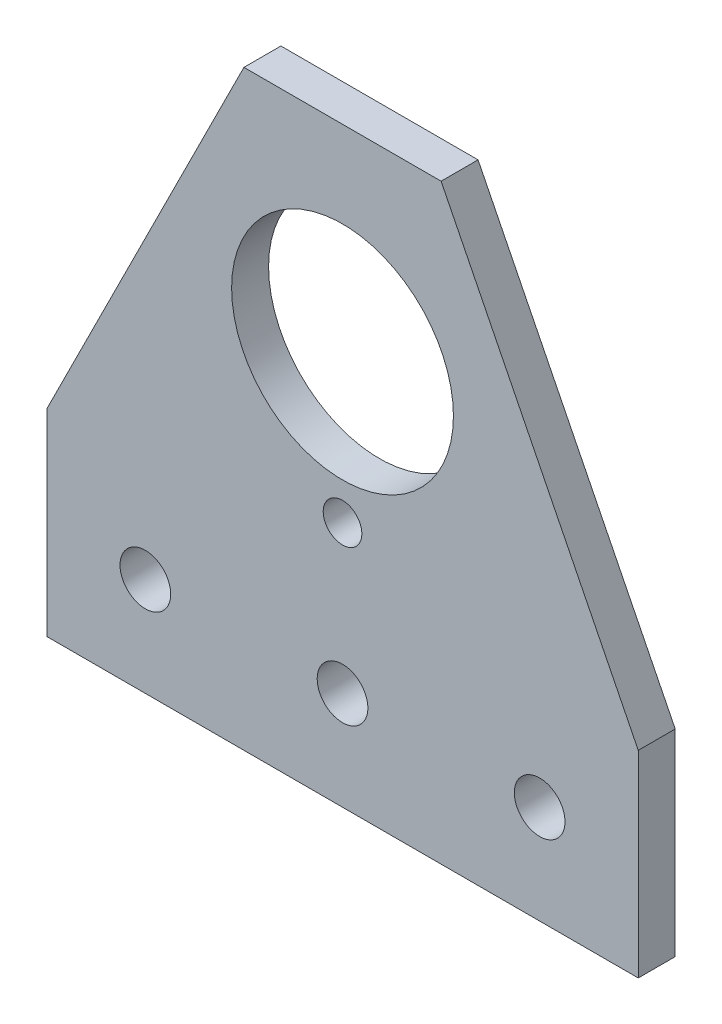
ISO-10303-21;
HEADER;
FILE_DESCRIPTION(('STEP AP214'),'2;1');
FILE_NAME('part.step','',(''),(''),'','','');
FILE_SCHEMA(('AUTOMOTIVE_DESIGN { 1 0 10303 214 1 1 1 1 }'));
ENDSEC;
DATA;
#1=APPLICATION_CONTEXT('core data for automotive mechanical design processes');
#2=APPLICATION_PROTOCOL_DEFINITION('international standard','automotive_design',2000,#1);
#3=PRODUCT_CONTEXT('',#1,'mechanical');
#4=PRODUCT('Part','Part','',(#3));
#5=PRODUCT_RELATED_PRODUCT_CATEGORY('part','',(#4));
#6=PRODUCT_DEFINITION_FORMATION('','',#4);
#7=PRODUCT_DEFINITION_CONTEXT('part definition',#1,'design');
#8=PRODUCT_DEFINITION('design','',#6,#7);
#9=PRODUCT_DEFINITION_SHAPE('','',#8);
#10=(LENGTH_UNIT() NAMED_UNIT(*) SI_UNIT(.MILLI.,.METRE.));
#11=(NAMED_UNIT(*) PLANE_ANGLE_UNIT() SI_UNIT($,.RADIAN.));
#12=(NAMED_UNIT(*) SI_UNIT($,.STERADIAN.) SOLID_ANGLE_UNIT());
#13=UNCERTAINTY_MEASURE_WITH_UNIT(LENGTH_MEASURE(1.E-05),#10,'distance_accuracy_value','');
#14=(GEOMETRIC_REPRESENTATION_CONTEXT(3) GLOBAL_UNCERTAINTY_ASSIGNED_CONTEXT((#13)) GLOBAL_UNIT_ASSIGNED_CONTEXT((#10,
#11,#12)) REPRESENTATION_CONTEXT('',''));
#15=CARTESIAN_POINT('',(0.,0.,0.));
#16=DIRECTION('',(0.,0.,1.));
#17=DIRECTION('',(1.,0.,0.));
#18=AXIS2_PLACEMENT_3D('',#15,#16,#17);
#19=CARTESIAN_POINT('',(0.,0.,4.7625));
#20=DIRECTION('',(0.,0.,1.));
#21=DIRECTION('',(1.,0.,0.));
#22=AXIS2_PLACEMENT_3D('',#19,#20,#21);
#23=PLANE('',#22);
#24=CARTESIAN_POINT('',(38.0999999999999,50.8,4.7625));
#25=DIRECTION('',(0.,0.,1.));
#26=DIRECTION('',(1.,0.,0.));
#27=AXIS2_PLACEMENT_3D('',#24,#25,#26);
#28=CIRCLE('',#27,14.2875);
#29=CARTESIAN_POINT('',(23.8124999999999,50.8,4.7625));
#30=VERTEX_POINT('',#29);
#31=EDGE_CURVE('E192',#30,#30,#28,.T.);
#32=ORIENTED_EDGE('',*,*,#31,.F.);
#33=EDGE_LOOP('',(#32));
#34=FACE_BOUND('',#33,.T.);
#35=CARTESIAN_POINT('',(12.7,12.7,4.7625));
#36=DIRECTION('',(0.,0.,1.));
#37=DIRECTION('',(1.,0.,0.));
#38=AXIS2_PLACEMENT_3D('',#35,#36,#37);
#39=CIRCLE('',#38,3.2639);
#40=CARTESIAN_POINT('',(9.4361,12.7,4.7625));
#41=VERTEX_POINT('',#40);
#42=EDGE_CURVE('E204',#41,#41,#39,.T.);
#43=ORIENTED_EDGE('',*,*,#42,.F.);
#44=EDGE_LOOP('',(#43));
#45=FACE_BOUND('',#44,.T.);
#46=DIRECTION('',(0.,-1.,0.));
#47=VECTOR('',#46,1.);
#48=CARTESIAN_POINT('',(0.,25.4,4.7625));
#49=LINE('',#48,#47);
#50=CARTESIAN_POINT('',(0.,25.4,4.7625));
#51=VERTEX_POINT('',#50);
#52=CARTESIAN_POINT('',(0.,0.,4.7625));
#53=VERTEX_POINT('',#52);
#54=EDGE_CURVE('E128',#51,#53,#49,.T.);
#55=ORIENTED_EDGE('',*,*,#54,.T.);
#56=DIRECTION('',(1.,0.,0.));
#57=VECTOR('',#56,1.);
#58=CARTESIAN_POINT('',(0.,0.,4.7625));
#59=LINE('',#58,#57);
#60=CARTESIAN_POINT('',(76.2,0.,4.7625));
#61=VERTEX_POINT('',#60);
#62=EDGE_CURVE('E86',#53,#61,#59,.T.);
#63=ORIENTED_EDGE('',*,*,#62,.T.);
#64=DIRECTION('',(0.,1.,0.));
#65=VECTOR('',#64,1.);
#66=CARTESIAN_POINT('',(76.2,0.,4.7625));
#67=LINE('',#66,#65);
#68=CARTESIAN_POINT('',(76.2,25.4,4.7625));
#69=VERTEX_POINT('',#68);
#70=EDGE_CURVE('E99',#61,#69,#67,.T.);
#71=ORIENTED_EDGE('',*,*,#70,.T.);
#72=DIRECTION('',(-0.447213595499958,0.894427190999916,0.));
#73=VECTOR('',#72,1.);
#74=CARTESIAN_POINT('',(76.2,25.4,4.7625));
#75=LINE('',#74,#73);
#76=CARTESIAN_POINT('',(50.8,76.2,4.7625));
#77=VERTEX_POINT('',#76);
#78=EDGE_CURVE('E93',#69,#77,#75,.T.);
#79=ORIENTED_EDGE('',*,*,#78,.T.);
#80=DIRECTION('',(-1.,0.,0.));
#81=VECTOR('',#80,1.);
#82=CARTESIAN_POINT('',(50.8,76.2,4.7625));
#83=LINE('',#82,#81);
#84=CARTESIAN_POINT('',(25.4,76.2,4.7625));
#85=VERTEX_POINT('',#84);
#86=EDGE_CURVE('E97',#77,#85,#83,.T.);
#87=ORIENTED_EDGE('',*,*,#86,.T.);
#88=DIRECTION('',(-0.447213595499958,-0.894427190999916,0.));
#89=VECTOR('',#88,1.);
#90=CARTESIAN_POINT('',(25.4,76.2,4.7625));
#91=LINE('',#90,#89);
#92=EDGE_CURVE('E49',#85,#51,#91,.T.);
#93=ORIENTED_EDGE('',*,*,#92,.T.);
#94=EDGE_LOOP('',(#55,#63,#71,#79,#87,#93));
#95=FACE_BOUND('',#94,.T.);
#96=CARTESIAN_POINT('',(38.1,12.7,4.7625));
#97=DIRECTION('',(0.,0.,1.));
#98=DIRECTION('',(1.,0.,0.));
#99=AXIS2_PLACEMENT_3D('',#96,#97,#98);
#100=CIRCLE('',#99,3.2639);
#101=CARTESIAN_POINT('',(34.8361,12.7,4.7625));
#102=VERTEX_POINT('',#101);
#103=EDGE_CURVE('E121',#102,#102,#100,.T.);
#104=ORIENTED_EDGE('',*,*,#103,.F.);
#105=EDGE_LOOP('',(#104));
#106=FACE_BOUND('',#105,.T.);
#107=CARTESIAN_POINT('',(63.5,12.7,4.7625));
#108=DIRECTION('',(0.,0.,1.));
#109=DIRECTION('',(1.,0.,0.));
#110=AXIS2_PLACEMENT_3D('',#107,#108,#109);
#111=CIRCLE('',#110,3.26390000000001);
#112=CARTESIAN_POINT('',(60.2361,12.7,4.7625));
#113=VERTEX_POINT('',#112);
#114=EDGE_CURVE('E198',#113,#113,#111,.T.);
#115=ORIENTED_EDGE('',*,*,#114,.F.);
#116=EDGE_LOOP('',(#115));
#117=FACE_BOUND('',#116,.T.);
#118=CARTESIAN_POINT('',(38.0999999999999,31.75,4.7625));
#119=DIRECTION('',(0.,0.,1.));
#120=DIRECTION('',(1.,0.,0.));
#121=AXIS2_PLACEMENT_3D('',#118,#119,#120);
#122=CIRCLE('',#121,2.4892);
#123=CARTESIAN_POINT('',(35.6107999999999,31.75,4.7625));
#124=VERTEX_POINT('',#123);
#125=EDGE_CURVE('E183',#124,#124,#122,.T.);
#126=ORIENTED_EDGE('',*,*,#125,.F.);
#127=EDGE_LOOP('',(#126));
#128=FACE_BOUND('',#127,.T.);
#129=ADVANCED_FACE('F32',(#34,#45,#95,#106,#117,#128),#23,.T.);
#130=CARTESIAN_POINT('',(0.,0.,0.));
#131=DIRECTION('',(0.,0.,1.));
#132=DIRECTION('',(1.,0.,0.));
#133=AXIS2_PLACEMENT_3D('',#130,#131,#132);
#134=PLANE('',#133);
#135=DIRECTION('',(0.,-1.,0.));
#136=VECTOR('',#135,1.);
#137=CARTESIAN_POINT('',(0.,25.4,0.));
#138=LINE('',#137,#136);
#139=CARTESIAN_POINT('',(0.,25.4,0.));
#140=VERTEX_POINT('',#139);
#141=CARTESIAN_POINT('',(0.,0.,0.));
#142=VERTEX_POINT('',#141);
#143=EDGE_CURVE('E117',#140,#142,#138,.T.);
#144=ORIENTED_EDGE('',*,*,#143,.F.);
#145=DIRECTION('',(-0.447213595499958,-0.894427190999916,0.));
#146=VECTOR('',#145,1.);
#147=CARTESIAN_POINT('',(25.4,76.2,0.));
#148=LINE('',#147,#146);
#149=CARTESIAN_POINT('',(25.4,76.2,0.));
#150=VERTEX_POINT('',#149);
#151=EDGE_CURVE('E78',#150,#140,#148,.T.);
#152=ORIENTED_EDGE('',*,*,#151,.F.);
#153=DIRECTION('',(-1.,0.,0.));
#154=VECTOR('',#153,1.);
#155=CARTESIAN_POINT('',(50.8,76.2,0.));
#156=LINE('',#155,#154);
#157=CARTESIAN_POINT('',(50.8,76.2,0.));
#158=VERTEX_POINT('',#157);
#159=EDGE_CURVE('E72',#158,#150,#156,.T.);
#160=ORIENTED_EDGE('',*,*,#159,.F.);
#161=DIRECTION('',(-0.447213595499958,0.894427190999916,0.));
#162=VECTOR('',#161,1.);
#163=CARTESIAN_POINT('',(76.2,25.4,0.));
#164=LINE('',#163,#162);
#165=CARTESIAN_POINT('',(76.2,25.4,0.));
#166=VERTEX_POINT('',#165);
#167=EDGE_CURVE('E107',#166,#158,#164,.T.);
#168=ORIENTED_EDGE('',*,*,#167,.F.);
#169=DIRECTION('',(0.,1.,0.));
#170=VECTOR('',#169,1.);
#171=CARTESIAN_POINT('',(76.2,0.,0.));
#172=LINE('',#171,#170);
#173=CARTESIAN_POINT('',(76.2,0.,0.));
#174=VERTEX_POINT('',#173);
#175=EDGE_CURVE('E123',#174,#166,#172,.T.);
#176=ORIENTED_EDGE('',*,*,#175,.F.);
#177=DIRECTION('',(1.,0.,0.));
#178=VECTOR('',#177,1.);
#179=CARTESIAN_POINT('',(0.,0.,0.));
#180=LINE('',#179,#178);
#181=EDGE_CURVE('E120',#142,#174,#180,.T.);
#182=ORIENTED_EDGE('',*,*,#181,.F.);
#183=EDGE_LOOP('',(#144,#152,#160,#168,#176,#182));
#184=FACE_BOUND('',#183,.T.);
#185=CARTESIAN_POINT('',(38.1,12.7,0.));
#186=DIRECTION('',(0.,0.,1.));
#187=DIRECTION('',(1.,0.,0.));
#188=AXIS2_PLACEMENT_3D('',#185,#186,#187);
#189=CIRCLE('',#188,3.2639);
#190=CARTESIAN_POINT('',(34.8361,12.7,0.));
#191=VERTEX_POINT('',#190);
#192=EDGE_CURVE('E207',#191,#191,#189,.T.);
#193=ORIENTED_EDGE('',*,*,#192,.T.);
#194=EDGE_LOOP('',(#193));
#195=FACE_BOUND('',#194,.T.);
#196=CARTESIAN_POINT('',(12.7,12.7,0.));
#197=DIRECTION('',(0.,0.,1.));
#198=DIRECTION('',(1.,0.,0.));
#199=AXIS2_PLACEMENT_3D('',#196,#197,#198);
#200=CIRCLE('',#199,3.2639);
#201=CARTESIAN_POINT('',(9.4361,12.7,0.));
#202=VERTEX_POINT('',#201);
#203=EDGE_CURVE('E201',#202,#202,#200,.T.);
#204=ORIENTED_EDGE('',*,*,#203,.T.);
#205=EDGE_LOOP('',(#204));
#206=FACE_BOUND('',#205,.T.);
#207=CARTESIAN_POINT('',(63.5,12.7,0.));
#208=DIRECTION('',(0.,0.,1.));
#209=DIRECTION('',(1.,0.,0.));
#210=AXIS2_PLACEMENT_3D('',#207,#208,#209);
#211=CIRCLE('',#210,3.26390000000001);
#212=CARTESIAN_POINT('',(60.2361,12.7,0.));
#213=VERTEX_POINT('',#212);
#214=EDGE_CURVE('E195',#213,#213,#211,.T.);
#215=ORIENTED_EDGE('',*,*,#214,.T.);
#216=EDGE_LOOP('',(#215));
#217=FACE_BOUND('',#216,.T.);
#218=CARTESIAN_POINT('',(38.0999999999999,50.8,0.));
#219=DIRECTION('',(0.,0.,1.));
#220=DIRECTION('',(1.,0.,0.));
#221=AXIS2_PLACEMENT_3D('',#218,#219,#220);
#222=CIRCLE('',#221,14.2875);
#223=CARTESIAN_POINT('',(23.8124999999999,50.8,0.));
#224=VERTEX_POINT('',#223);
#225=EDGE_CURVE('E189',#224,#224,#222,.T.);
#226=ORIENTED_EDGE('',*,*,#225,.T.);
#227=EDGE_LOOP('',(#226));
#228=FACE_BOUND('',#227,.T.);
#229=CARTESIAN_POINT('',(38.0999999999999,31.75,0.));
#230=DIRECTION('',(0.,0.,1.));
#231=DIRECTION('',(1.,0.,0.));
#232=AXIS2_PLACEMENT_3D('',#229,#230,#231);
#233=CIRCLE('',#232,2.4892);
#234=CARTESIAN_POINT('',(35.6107999999999,31.75,0.));
#235=VERTEX_POINT('',#234);
#236=EDGE_CURVE('E186',#235,#235,#233,.T.);
#237=ORIENTED_EDGE('',*,*,#236,.T.);
#238=EDGE_LOOP('',(#237));
#239=FACE_BOUND('',#238,.T.);
#240=ADVANCED_FACE('F137',(#184,#195,#206,#217,#228,#239),#134,.F.);
#241=CARTESIAN_POINT('',(0.,25.4,4.7625));
#242=DIRECTION('',(1.,0.,0.));
#243=DIRECTION('',(0.,1.,0.));
#244=AXIS2_PLACEMENT_3D('',#241,#242,#243);
#245=PLANE('',#244);
#246=ORIENTED_EDGE('',*,*,#143,.T.);
#247=DIRECTION('',(0.,0.,-1.));
#248=VECTOR('',#247,1.);
#249=CARTESIAN_POINT('',(0.,0.,4.7625));
#250=LINE('',#249,#248);
#251=EDGE_CURVE('E11',#53,#142,#250,.T.);
#252=ORIENTED_EDGE('',*,*,#251,.F.);
#253=ORIENTED_EDGE('',*,*,#54,.F.);
#254=DIRECTION('',(0.,0.,-1.));
#255=VECTOR('',#254,1.);
#256=CARTESIAN_POINT('',(0.,25.4,4.7625));
#257=LINE('',#256,#255);
#258=EDGE_CURVE('E113',#51,#140,#257,.T.);
#259=ORIENTED_EDGE('',*,*,#258,.T.);
#260=EDGE_LOOP('',(#246,#252,#253,#259));
#261=FACE_BOUND('',#260,.T.);
#262=ADVANCED_FACE('F34',(#261),#245,.F.);
#263=CARTESIAN_POINT('',(0.,0.,4.7625));
#264=DIRECTION('',(0.,1.,0.));
#265=DIRECTION('',(0.,0.,1.));
#266=AXIS2_PLACEMENT_3D('',#263,#264,#265);
#267=PLANE('',#266);
#268=ORIENTED_EDGE('',*,*,#181,.T.);
#269=DIRECTION('',(0.,0.,-1.));
#270=VECTOR('',#269,1.);
#271=CARTESIAN_POINT('',(76.2,0.,4.7625));
#272=LINE('',#271,#270);
#273=EDGE_CURVE('E41',#61,#174,#272,.T.);
#274=ORIENTED_EDGE('',*,*,#273,.F.);
#275=ORIENTED_EDGE('',*,*,#62,.F.);
#276=ORIENTED_EDGE('',*,*,#251,.T.);
#277=EDGE_LOOP('',(#268,#274,#275,#276));
#278=FACE_BOUND('',#277,.T.);
#279=ADVANCED_FACE('F274',(#278),#267,.F.);
#280=CARTESIAN_POINT('',(76.2,0.,4.7625));
#281=DIRECTION('',(-1.,0.,0.));
#282=DIRECTION('',(0.,0.,1.));
#283=AXIS2_PLACEMENT_3D('',#280,#281,#282);
#284=PLANE('',#283);
#285=ORIENTED_EDGE('',*,*,#175,.T.);
#286=DIRECTION('',(0.,0.,-1.));
#287=VECTOR('',#286,1.);
#288=CARTESIAN_POINT('',(76.2,25.4,4.7625));
#289=LINE('',#288,#287);
#290=EDGE_CURVE('E108',#69,#166,#289,.T.);
#291=ORIENTED_EDGE('',*,*,#290,.F.);
#292=ORIENTED_EDGE('',*,*,#70,.F.);
#293=ORIENTED_EDGE('',*,*,#273,.T.);
#294=EDGE_LOOP('',(#285,#291,#292,#293));
#295=FACE_BOUND('',#294,.T.);
#296=ADVANCED_FACE('F134',(#295),#284,.F.);
#297=CARTESIAN_POINT('',(76.2,25.4,4.7625));
#298=DIRECTION('',(-0.894427190999916,-0.447213595499958,0.));
#299=DIRECTION('',(0.447213595499958,-0.894427190999916,0.));
#300=AXIS2_PLACEMENT_3D('',#297,#298,#299);
#301=PLANE('',#300);
#302=ORIENTED_EDGE('',*,*,#167,.T.);
#303=DIRECTION('',(0.,0.,-1.));
#304=VECTOR('',#303,1.);
#305=CARTESIAN_POINT('',(50.8,76.2,4.7625));
#306=LINE('',#305,#304);
#307=EDGE_CURVE('E104',#77,#158,#306,.T.);
#308=ORIENTED_EDGE('',*,*,#307,.F.);
#309=ORIENTED_EDGE('',*,*,#78,.F.);
#310=ORIENTED_EDGE('',*,*,#290,.T.);
#311=EDGE_LOOP('',(#302,#308,#309,#310));
#312=FACE_BOUND('',#311,.T.);
#313=ADVANCED_FACE('F105',(#312),#301,.F.);
#314=CARTESIAN_POINT('',(50.8,76.2,4.7625));
#315=DIRECTION('',(0.,-1.,0.));
#316=DIRECTION('',(0.,0.,-1.));
#317=AXIS2_PLACEMENT_3D('',#314,#315,#316);
#318=PLANE('',#317);
#319=ORIENTED_EDGE('',*,*,#159,.T.);
#320=DIRECTION('',(0.,0.,-1.));
#321=VECTOR('',#320,1.);
#322=CARTESIAN_POINT('',(25.4,76.2,4.7625));
#323=LINE('',#322,#321);
#324=EDGE_CURVE('E109',#85,#150,#323,.T.);
#325=ORIENTED_EDGE('',*,*,#324,.F.);
#326=ORIENTED_EDGE('',*,*,#86,.F.);
#327=ORIENTED_EDGE('',*,*,#307,.T.);
#328=EDGE_LOOP('',(#319,#325,#326,#327));
#329=FACE_BOUND('',#328,.T.);
#330=ADVANCED_FACE('F111',(#329),#318,.F.);
#331=CARTESIAN_POINT('',(25.4,76.2,4.7625));
#332=DIRECTION('',(0.894427190999916,-0.447213595499958,0.));
#333=DIRECTION('',(0.447213595499958,0.894427190999916,0.));
#334=AXIS2_PLACEMENT_3D('',#331,#332,#333);
#335=PLANE('',#334);
#336=ORIENTED_EDGE('',*,*,#151,.T.);
#337=ORIENTED_EDGE('',*,*,#258,.F.);
#338=ORIENTED_EDGE('',*,*,#92,.F.);
#339=ORIENTED_EDGE('',*,*,#324,.T.);
#340=EDGE_LOOP('',(#336,#337,#338,#339));
#341=FACE_BOUND('',#340,.T.);
#342=ADVANCED_FACE('F142',(#341),#335,.F.);
#343=CARTESIAN_POINT('',(38.1,12.7,4.7625));
#344=DIRECTION('',(0.,0.,-1.));
#345=DIRECTION('',(-1.,0.,0.));
#346=AXIS2_PLACEMENT_3D('',#343,#344,#345);
#347=CYLINDRICAL_SURFACE('',#346,3.2639);
#348=CARTESIAN_POINT('',(34.8361,12.7,4.7625));
#349=CARTESIAN_POINT('',(34.8361,12.7,4.712890625));
#350=CARTESIAN_POINT('',(34.8361,12.7,4.66328125));
#351=CARTESIAN_POINT('',(34.8361,12.7,4.5640625));
#352=CARTESIAN_POINT('',(34.8361,12.7,4.514453125));
#353=CARTESIAN_POINT('',(34.8361,12.7,4.415234375));
#354=CARTESIAN_POINT('',(34.8361,12.7,4.365625));
#355=CARTESIAN_POINT('',(34.8361,12.7,4.26640625));
#356=CARTESIAN_POINT('',(34.8361,12.7,4.216796875));
#357=CARTESIAN_POINT('',(34.8361,12.7,4.117578125));
#358=CARTESIAN_POINT('',(34.8361,12.7,4.06796875));
#359=CARTESIAN_POINT('',(34.8361,12.7,3.96875));
#360=CARTESIAN_POINT('',(34.8361,12.7,3.919140625));
#361=CARTESIAN_POINT('',(34.8361,12.7,3.819921875));
#362=CARTESIAN_POINT('',(34.8361,12.7,3.7703125));
#363=CARTESIAN_POINT('',(34.8361,12.7,3.67109375));
#364=CARTESIAN_POINT('',(34.8361,12.7,3.621484375));
#365=CARTESIAN_POINT('',(34.8361,12.7,3.522265625));
#366=CARTESIAN_POINT('',(34.8361,12.7,3.47265625));
#367=CARTESIAN_POINT('',(34.8361,12.7,3.3734375));
#368=CARTESIAN_POINT('',(34.8361,12.7,3.323828125));
#369=CARTESIAN_POINT('',(34.8361,12.7,3.224609375));
#370=CARTESIAN_POINT('',(34.8361,12.7,3.175));
#371=CARTESIAN_POINT('',(34.8361,12.7,3.07578125));
#372=CARTESIAN_POINT('',(34.8361,12.7,3.026171875));
#373=CARTESIAN_POINT('',(34.8361,12.7,2.926953125));
#374=CARTESIAN_POINT('',(34.8361,12.7,2.87734375));
#375=CARTESIAN_POINT('',(34.8361,12.7,2.778125));
#376=CARTESIAN_POINT('',(34.8361,12.7,2.728515625));
#377=CARTESIAN_POINT('',(34.8361,12.7,2.629296875));
#378=CARTESIAN_POINT('',(34.8361,12.7,2.5796875));
#379=CARTESIAN_POINT('',(34.8361,12.7,2.48046875));
#380=CARTESIAN_POINT('',(34.8361,12.7,2.430859375));
#381=CARTESIAN_POINT('',(34.8361,12.7,2.331640625));
#382=CARTESIAN_POINT('',(34.8361,12.7,2.28203125));
#383=CARTESIAN_POINT('',(34.8361,12.7,2.1828125));
#384=CARTESIAN_POINT('',(34.8361,12.7,2.133203125));
#385=CARTESIAN_POINT('',(34.8361,12.7,2.033984375));
#386=CARTESIAN_POINT('',(34.8361,12.7,1.984375));
#387=CARTESIAN_POINT('',(34.8361,12.7,1.88515625));
#388=CARTESIAN_POINT('',(34.8361,12.7,1.835546875));
#389=CARTESIAN_POINT('',(34.8361,12.7,1.736328125));
#390=CARTESIAN_POINT('',(34.8361,12.7,1.68671875));
#391=CARTESIAN_POINT('',(34.8361,12.7,1.5875));
#392=CARTESIAN_POINT('',(34.8361,12.7,1.537890625));
#393=CARTESIAN_POINT('',(34.8361,12.7,1.438671875));
#394=CARTESIAN_POINT('',(34.8361,12.7,1.3890625));
#395=CARTESIAN_POINT('',(34.8361,12.7,1.28984375));
#396=CARTESIAN_POINT('',(34.8361,12.7,1.240234375));
#397=CARTESIAN_POINT('',(34.8361,12.7,1.141015625));
#398=CARTESIAN_POINT('',(34.8361,12.7,1.09140625));
#399=CARTESIAN_POINT('',(34.8361,12.7,0.9921875));
#400=CARTESIAN_POINT('',(34.8361,12.7,0.942578125));
#401=CARTESIAN_POINT('',(34.8361,12.7,0.843359375));
#402=CARTESIAN_POINT('',(34.8361,12.7,0.79375));
#403=CARTESIAN_POINT('',(34.8361,12.7,0.69453125));
#404=CARTESIAN_POINT('',(34.8361,12.7,0.644921875));
#405=CARTESIAN_POINT('',(34.8361,12.7,0.545703125));
#406=CARTESIAN_POINT('',(34.8361,12.7,0.49609375));
#407=CARTESIAN_POINT('',(34.8361,12.7,0.396875));
#408=CARTESIAN_POINT('',(34.8361,12.7,0.347265625));
#409=CARTESIAN_POINT('',(34.8361,12.7,0.248046875));
#410=CARTESIAN_POINT('',(34.8361,12.7,0.1984375));
#411=CARTESIAN_POINT('',(34.8361,12.7,0.09921875));
#412=CARTESIAN_POINT('',(34.8361,12.7,0.049609375));
#413=CARTESIAN_POINT('',(34.8361,12.7,0.));
#414=B_SPLINE_CURVE_WITH_KNOTS('',3,(#348,#349,#350,#351,#352,#353,#354,#355,#356,#357,#358,
#359,#360,#361,#362,#363,#364,#365,#366,#367,#368,#369,#370,#371,#372,#373,#374,#375,#376,#377,
#378,#379,#380,#381,#382,#383,#384,#385,#386,#387,#388,#389,#390,#391,#392,#393,#394,#395,#396,
#397,#398,#399,#400,#401,#402,#403,#404,#405,#406,#407,#408,#409,#410,#411,#412,#413),
.UNSPECIFIED.,.F.,.F.,(4,2,2,2,2,2,2,2,2,2,2,2,2,2,2,2,2,2,2,2,2,2,2,2,2,2,2,2,2,2,2,2,4),(0.,
0.148828124999999,0.297656249999999,0.446484374999999,0.595312499999999,0.744140625,0.89296875,
1.041796875,1.190625,1.339453125,1.48828125,1.637109375,1.7859375,1.934765625,2.08359375,
2.232421875,2.38125,2.530078125,2.67890625,2.827734375,2.9765625,3.125390625,3.27421875,
3.423046875,3.571875,3.720703125,3.86953125,4.018359375,4.1671875,4.316015625,4.46484375,
4.613671875,4.7625),.UNSPECIFIED.);
#415=EDGE_CURVE('BSEAM144',#102,#191,#414,.T.);
#416=ORIENTED_EDGE('',*,*,#103,.T.);
#417=ORIENTED_EDGE('',*,*,#192,.F.);
#418=ORIENTED_EDGE('',*,*,#415,.T.);
#419=ORIENTED_EDGE('',*,*,#415,.F.);
#420=EDGE_LOOP('',(#416,#418,#417,#419));
#421=FACE_BOUND('',#420,.T.);
#422=ADVANCED_FACE('F144',(#421),#347,.F.);
#423=CARTESIAN_POINT('',(12.7,12.7,4.7625));
#424=DIRECTION('',(0.,0.,-1.));
#425=DIRECTION('',(-1.,0.,0.));
#426=AXIS2_PLACEMENT_3D('',#423,#424,#425);
#427=CYLINDRICAL_SURFACE('',#426,3.2639);
#428=CARTESIAN_POINT('',(9.4361,12.7,4.7625));
#429=CARTESIAN_POINT('',(9.4361,12.7,4.712890625));
#430=CARTESIAN_POINT('',(9.4361,12.7,4.66328125));
#431=CARTESIAN_POINT('',(9.4361,12.7,4.5640625));
#432=CARTESIAN_POINT('',(9.4361,12.7,4.514453125));
#433=CARTESIAN_POINT('',(9.4361,12.7,4.415234375));
#434=CARTESIAN_POINT('',(9.4361,12.7,4.365625));
#435=CARTESIAN_POINT('',(9.4361,12.7,4.26640625));
#436=CARTESIAN_POINT('',(9.4361,12.7,4.216796875));
#437=CARTESIAN_POINT('',(9.4361,12.7,4.117578125));
#438=CARTESIAN_POINT('',(9.4361,12.7,4.06796875));
#439=CARTESIAN_POINT('',(9.4361,12.7,3.96875));
#440=CARTESIAN_POINT('',(9.4361,12.7,3.919140625));
#441=CARTESIAN_POINT('',(9.4361,12.7,3.819921875));
#442=CARTESIAN_POINT('',(9.4361,12.7,3.7703125));
#443=CARTESIAN_POINT('',(9.4361,12.7,3.67109375));
#444=CARTESIAN_POINT('',(9.4361,12.7,3.621484375));
#445=CARTESIAN_POINT('',(9.4361,12.7,3.522265625));
#446=CARTESIAN_POINT('',(9.4361,12.7,3.47265625));
#447=CARTESIAN_POINT('',(9.4361,12.7,3.3734375));
#448=CARTESIAN_POINT('',(9.4361,12.7,3.323828125));
#449=CARTESIAN_POINT('',(9.4361,12.7,3.224609375));
#450=CARTESIAN_POINT('',(9.4361,12.7,3.175));
#451=CARTESIAN_POINT('',(9.4361,12.7,3.07578125));
#452=CARTESIAN_POINT('',(9.4361,12.7,3.026171875));
#453=CARTESIAN_POINT('',(9.4361,12.7,2.926953125));
#454=CARTESIAN_POINT('',(9.4361,12.7,2.87734375));
#455=CARTESIAN_POINT('',(9.4361,12.7,2.778125));
#456=CARTESIAN_POINT('',(9.4361,12.7,2.728515625));
#457=CARTESIAN_POINT('',(9.4361,12.7,2.629296875));
#458=CARTESIAN_POINT('',(9.4361,12.7,2.5796875));
#459=CARTESIAN_POINT('',(9.4361,12.7,2.48046875));
#460=CARTESIAN_POINT('',(9.4361,12.7,2.430859375));
#461=CARTESIAN_POINT('',(9.4361,12.7,2.331640625));
#462=CARTESIAN_POINT('',(9.4361,12.7,2.28203125));
#463=CARTESIAN_POINT('',(9.4361,12.7,2.1828125));
#464=CARTESIAN_POINT('',(9.4361,12.7,2.133203125));
#465=CARTESIAN_POINT('',(9.4361,12.7,2.033984375));
#466=CARTESIAN_POINT('',(9.4361,12.7,1.984375));
#467=CARTESIAN_POINT('',(9.4361,12.7,1.88515625));
#468=CARTESIAN_POINT('',(9.4361,12.7,1.835546875));
#469=CARTESIAN_POINT('',(9.4361,12.7,1.736328125));
#470=CARTESIAN_POINT('',(9.4361,12.7,1.68671875));
#471=CARTESIAN_POINT('',(9.4361,12.7,1.5875));
#472=CARTESIAN_POINT('',(9.4361,12.7,1.537890625));
#473=CARTESIAN_POINT('',(9.4361,12.7,1.438671875));
#474=CARTESIAN_POINT('',(9.4361,12.7,1.3890625));
#475=CARTESIAN_POINT('',(9.4361,12.7,1.28984375));
#476=CARTESIAN_POINT('',(9.4361,12.7,1.240234375));
#477=CARTESIAN_POINT('',(9.4361,12.7,1.141015625));
#478=CARTESIAN_POINT('',(9.4361,12.7,1.09140625));
#479=CARTESIAN_POINT('',(9.4361,12.7,0.9921875));
#480=CARTESIAN_POINT('',(9.4361,12.7,0.942578125));
#481=CARTESIAN_POINT('',(9.4361,12.7,0.843359375));
#482=CARTESIAN_POINT('',(9.4361,12.7,0.79375));
#483=CARTESIAN_POINT('',(9.4361,12.7,0.69453125));
#484=CARTESIAN_POINT('',(9.4361,12.7,0.644921875));
#485=CARTESIAN_POINT('',(9.4361,12.7,0.545703125));
#486=CARTESIAN_POINT('',(9.4361,12.7,0.49609375));
#487=CARTESIAN_POINT('',(9.4361,12.7,0.396875));
#488=CARTESIAN_POINT('',(9.4361,12.7,0.347265625));
#489=CARTESIAN_POINT('',(9.4361,12.7,0.248046875));
#490=CARTESIAN_POINT('',(9.4361,12.7,0.1984375));
#491=CARTESIAN_POINT('',(9.4361,12.7,0.09921875));
#492=CARTESIAN_POINT('',(9.4361,12.7,0.049609375));
#493=CARTESIAN_POINT('',(9.4361,12.7,0.));
#494=B_SPLINE_CURVE_WITH_KNOTS('',3,(#428,#429,#430,#431,#432,#433,#434,#435,#436,#437,#438,
#439,#440,#441,#442,#443,#444,#445,#446,#447,#448,#449,#450,#451,#452,#453,#454,#455,#456,#457,
#458,#459,#460,#461,#462,#463,#464,#465,#466,#467,#468,#469,#470,#471,#472,#473,#474,#475,#476,
#477,#478,#479,#480,#481,#482,#483,#484,#485,#486,#487,#488,#489,#490,#491,#492,#493),
.UNSPECIFIED.,.F.,.F.,(4,2,2,2,2,2,2,2,2,2,2,2,2,2,2,2,2,2,2,2,2,2,2,2,2,2,2,2,2,2,2,2,4),(0.,
0.148828124999999,0.297656249999999,0.446484374999999,0.595312499999999,0.744140625,0.89296875,
1.041796875,1.190625,1.339453125,1.48828125,1.637109375,1.7859375,1.934765625,2.08359375,
2.232421875,2.38125,2.530078125,2.67890625,2.827734375,2.9765625,3.125390625,3.27421875,
3.423046875,3.571875,3.720703125,3.86953125,4.018359375,4.1671875,4.316015625,4.46484375,
4.613671875,4.7625),.UNSPECIFIED.);
#495=EDGE_CURVE('BSEAM150',#41,#202,#494,.T.);
#496=ORIENTED_EDGE('',*,*,#42,.T.);
#497=ORIENTED_EDGE('',*,*,#203,.F.);
#498=ORIENTED_EDGE('',*,*,#495,.T.);
#499=ORIENTED_EDGE('',*,*,#495,.F.);
#500=EDGE_LOOP('',(#496,#498,#497,#499));
#501=FACE_BOUND('',#500,.T.);
#502=ADVANCED_FACE('F150',(#501),#427,.F.);
#503=CARTESIAN_POINT('',(63.5,12.7,4.7625));
#504=DIRECTION('',(0.,0.,-1.));
#505=DIRECTION('',(-1.,0.,0.));
#506=AXIS2_PLACEMENT_3D('',#503,#504,#505);
#507=CYLINDRICAL_SURFACE('',#506,3.26390000000001);
#508=CARTESIAN_POINT('',(60.2361,12.7,4.7625));
#509=CARTESIAN_POINT('',(60.2361,12.7,4.712890625));
#510=CARTESIAN_POINT('',(60.2361,12.7,4.66328125));
#511=CARTESIAN_POINT('',(60.2361,12.7,4.5640625));
#512=CARTESIAN_POINT('',(60.2361,12.7,4.514453125));
#513=CARTESIAN_POINT('',(60.2361,12.7,4.415234375));
#514=CARTESIAN_POINT('',(60.2361,12.7,4.365625));
#515=CARTESIAN_POINT('',(60.2361,12.7,4.26640625));
#516=CARTESIAN_POINT('',(60.2361,12.7,4.216796875));
#517=CARTESIAN_POINT('',(60.2361,12.7,4.117578125));
#518=CARTESIAN_POINT('',(60.2361,12.7,4.06796875));
#519=CARTESIAN_POINT('',(60.2361,12.7,3.96875));
#520=CARTESIAN_POINT('',(60.2361,12.7,3.919140625));
#521=CARTESIAN_POINT('',(60.2361,12.7,3.819921875));
#522=CARTESIAN_POINT('',(60.2361,12.7,3.7703125));
#523=CARTESIAN_POINT('',(60.2361,12.7,3.67109375));
#524=CARTESIAN_POINT('',(60.2361,12.7,3.621484375));
#525=CARTESIAN_POINT('',(60.2361,12.7,3.522265625));
#526=CARTESIAN_POINT('',(60.2361,12.7,3.47265625));
#527=CARTESIAN_POINT('',(60.2361,12.7,3.3734375));
#528=CARTESIAN_POINT('',(60.2361,12.7,3.323828125));
#529=CARTESIAN_POINT('',(60.2361,12.7,3.224609375));
#530=CARTESIAN_POINT('',(60.2361,12.7,3.175));
#531=CARTESIAN_POINT('',(60.2361,12.7,3.07578125));
#532=CARTESIAN_POINT('',(60.2361,12.7,3.026171875));
#533=CARTESIAN_POINT('',(60.2361,12.7,2.926953125));
#534=CARTESIAN_POINT('',(60.2361,12.7,2.87734375));
#535=CARTESIAN_POINT('',(60.2361,12.7,2.778125));
#536=CARTESIAN_POINT('',(60.2361,12.7,2.728515625));
#537=CARTESIAN_POINT('',(60.2361,12.7,2.629296875));
#538=CARTESIAN_POINT('',(60.2361,12.7,2.5796875));
#539=CARTESIAN_POINT('',(60.2361,12.7,2.48046875));
#540=CARTESIAN_POINT('',(60.2361,12.7,2.430859375));
#541=CARTESIAN_POINT('',(60.2361,12.7,2.331640625));
#542=CARTESIAN_POINT('',(60.2361,12.7,2.28203125));
#543=CARTESIAN_POINT('',(60.2361,12.7,2.1828125));
#544=CARTESIAN_POINT('',(60.2361,12.7,2.133203125));
#545=CARTESIAN_POINT('',(60.2361,12.7,2.033984375));
#546=CARTESIAN_POINT('',(60.2361,12.7,1.984375));
#547=CARTESIAN_POINT('',(60.2361,12.7,1.88515625));
#548=CARTESIAN_POINT('',(60.2361,12.7,1.835546875));
#549=CARTESIAN_POINT('',(60.2361,12.7,1.736328125));
#550=CARTESIAN_POINT('',(60.2361,12.7,1.68671875));
#551=CARTESIAN_POINT('',(60.2361,12.7,1.5875));
#552=CARTESIAN_POINT('',(60.2361,12.7,1.537890625));
#553=CARTESIAN_POINT('',(60.2361,12.7,1.438671875));
#554=CARTESIAN_POINT('',(60.2361,12.7,1.3890625));
#555=CARTESIAN_POINT('',(60.2361,12.7,1.28984375));
#556=CARTESIAN_POINT('',(60.2361,12.7,1.240234375));
#557=CARTESIAN_POINT('',(60.2361,12.7,1.141015625));
#558=CARTESIAN_POINT('',(60.2361,12.7,1.09140625));
#559=CARTESIAN_POINT('',(60.2361,12.7,0.9921875));
#560=CARTESIAN_POINT('',(60.2361,12.7,0.942578125));
#561=CARTESIAN_POINT('',(60.2361,12.7,0.843359375));
#562=CARTESIAN_POINT('',(60.2361,12.7,0.79375));
#563=CARTESIAN_POINT('',(60.2361,12.7,0.69453125));
#564=CARTESIAN_POINT('',(60.2361,12.7,0.644921875));
#565=CARTESIAN_POINT('',(60.2361,12.7,0.545703125));
#566=CARTESIAN_POINT('',(60.2361,12.7,0.49609375));
#567=CARTESIAN_POINT('',(60.2361,12.7,0.396875));
#568=CARTESIAN_POINT('',(60.2361,12.7,0.347265625));
#569=CARTESIAN_POINT('',(60.2361,12.7,0.248046875));
#570=CARTESIAN_POINT('',(60.2361,12.7,0.1984375));
#571=CARTESIAN_POINT('',(60.2361,12.7,0.09921875));
#572=CARTESIAN_POINT('',(60.2361,12.7,0.049609375));
#573=CARTESIAN_POINT('',(60.2361,12.7,0.));
#574=B_SPLINE_CURVE_WITH_KNOTS('',3,(#508,#509,#510,#511,#512,#513,#514,#515,#516,#517,#518,
#519,#520,#521,#522,#523,#524,#525,#526,#527,#528,#529,#530,#531,#532,#533,#534,#535,#536,#537,
#538,#539,#540,#541,#542,#543,#544,#545,#546,#547,#548,#549,#550,#551,#552,#553,#554,#555,#556,
#557,#558,#559,#560,#561,#562,#563,#564,#565,#566,#567,#568,#569,#570,#571,#572,#573),
.UNSPECIFIED.,.F.,.F.,(4,2,2,2,2,2,2,2,2,2,2,2,2,2,2,2,2,2,2,2,2,2,2,2,2,2,2,2,2,2,2,2,4),(0.,
0.148828124999999,0.297656249999999,0.446484374999999,0.595312499999999,0.744140625,0.89296875,
1.041796875,1.190625,1.339453125,1.48828125,1.637109375,1.7859375,1.934765625,2.08359375,
2.232421875,2.38125,2.530078125,2.67890625,2.827734375,2.9765625,3.125390625,3.27421875,
3.423046875,3.571875,3.720703125,3.86953125,4.018359375,4.1671875,4.316015625,4.46484375,
4.613671875,4.7625),.UNSPECIFIED.);
#575=EDGE_CURVE('BSEAM166',#113,#213,#574,.T.);
#576=ORIENTED_EDGE('',*,*,#114,.T.);
#577=ORIENTED_EDGE('',*,*,#214,.F.);
#578=ORIENTED_EDGE('',*,*,#575,.T.);
#579=ORIENTED_EDGE('',*,*,#575,.F.);
#580=EDGE_LOOP('',(#576,#578,#577,#579));
#581=FACE_BOUND('',#580,.T.);
#582=ADVANCED_FACE('F166',(#581),#507,.F.);
#583=CARTESIAN_POINT('',(38.0999999999999,50.8,4.7625));
#584=DIRECTION('',(0.,0.,-1.));
#585=DIRECTION('',(-1.,0.,0.));
#586=AXIS2_PLACEMENT_3D('',#583,#584,#585);
#587=CYLINDRICAL_SURFACE('',#586,14.2875);
#588=CARTESIAN_POINT('',(23.8124999999999,50.8,4.7625));
#589=CARTESIAN_POINT('',(23.8124999999999,50.8,4.712890625));
#590=CARTESIAN_POINT('',(23.8124999999999,50.8,4.66328125));
#591=CARTESIAN_POINT('',(23.8124999999999,50.8,4.5640625));
#592=CARTESIAN_POINT('',(23.8124999999999,50.8,4.514453125));
#593=CARTESIAN_POINT('',(23.8124999999999,50.8,4.415234375));
#594=CARTESIAN_POINT('',(23.8124999999999,50.8,4.365625));
#595=CARTESIAN_POINT('',(23.8124999999999,50.8,4.26640625));
#596=CARTESIAN_POINT('',(23.8124999999999,50.8,4.216796875));
#597=CARTESIAN_POINT('',(23.8124999999999,50.8,4.117578125));
#598=CARTESIAN_POINT('',(23.8124999999999,50.8,4.06796875));
#599=CARTESIAN_POINT('',(23.8124999999999,50.8,3.96875));
#600=CARTESIAN_POINT('',(23.8124999999999,50.8,3.919140625));
#601=CARTESIAN_POINT('',(23.8124999999999,50.8,3.819921875));
#602=CARTESIAN_POINT('',(23.8124999999999,50.8,3.7703125));
#603=CARTESIAN_POINT('',(23.8124999999999,50.8,3.67109375));
#604=CARTESIAN_POINT('',(23.8124999999999,50.8,3.621484375));
#605=CARTESIAN_POINT('',(23.8124999999999,50.8,3.522265625));
#606=CARTESIAN_POINT('',(23.8124999999999,50.8,3.47265625));
#607=CARTESIAN_POINT('',(23.8124999999999,50.8,3.3734375));
#608=CARTESIAN_POINT('',(23.8124999999999,50.8,3.323828125));
#609=CARTESIAN_POINT('',(23.8124999999999,50.8,3.224609375));
#610=CARTESIAN_POINT('',(23.8124999999999,50.8,3.175));
#611=CARTESIAN_POINT('',(23.8124999999999,50.8,3.07578125));
#612=CARTESIAN_POINT('',(23.8124999999999,50.8,3.026171875));
#613=CARTESIAN_POINT('',(23.8124999999999,50.8,2.926953125));
#614=CARTESIAN_POINT('',(23.8124999999999,50.8,2.87734375));
#615=CARTESIAN_POINT('',(23.8124999999999,50.8,2.778125));
#616=CARTESIAN_POINT('',(23.8124999999999,50.8,2.728515625));
#617=CARTESIAN_POINT('',(23.8124999999999,50.8,2.629296875));
#618=CARTESIAN_POINT('',(23.8124999999999,50.8,2.5796875));
#619=CARTESIAN_POINT('',(23.8124999999999,50.8,2.48046875));
#620=CARTESIAN_POINT('',(23.8124999999999,50.8,2.430859375));
#621=CARTESIAN_POINT('',(23.8124999999999,50.8,2.331640625));
#622=CARTESIAN_POINT('',(23.8124999999999,50.8,2.28203125));
#623=CARTESIAN_POINT('',(23.8124999999999,50.8,2.1828125));
#624=CARTESIAN_POINT('',(23.8124999999999,50.8,2.133203125));
#625=CARTESIAN_POINT('',(23.8124999999999,50.8,2.033984375));
#626=CARTESIAN_POINT('',(23.8124999999999,50.8,1.984375));
#627=CARTESIAN_POINT('',(23.8124999999999,50.8,1.88515625));
#628=CARTESIAN_POINT('',(23.8124999999999,50.8,1.835546875));
#629=CARTESIAN_POINT('',(23.8124999999999,50.8,1.736328125));
#630=CARTESIAN_POINT('',(23.8124999999999,50.8,1.68671875));
#631=CARTESIAN_POINT('',(23.8124999999999,50.8,1.5875));
#632=CARTESIAN_POINT('',(23.8124999999999,50.8,1.537890625));
#633=CARTESIAN_POINT('',(23.8124999999999,50.8,1.438671875));
#634=CARTESIAN_POINT('',(23.8124999999999,50.8,1.3890625));
#635=CARTESIAN_POINT('',(23.8124999999999,50.8,1.28984375));
#636=CARTESIAN_POINT('',(23.8124999999999,50.8,1.240234375));
#637=CARTESIAN_POINT('',(23.8124999999999,50.8,1.141015625));
#638=CARTESIAN_POINT('',(23.8124999999999,50.8,1.09140625));
#639=CARTESIAN_POINT('',(23.8124999999999,50.8,0.9921875));
#640=CARTESIAN_POINT('',(23.8124999999999,50.8,0.942578125));
#641=CARTESIAN_POINT('',(23.8124999999999,50.8,0.843359375));
#642=CARTESIAN_POINT('',(23.8124999999999,50.8,0.79375));
#643=CARTESIAN_POINT('',(23.8124999999999,50.8,0.69453125));
#644=CARTESIAN_POINT('',(23.8124999999999,50.8,0.644921875));
#645=CARTESIAN_POINT('',(23.8124999999999,50.8,0.545703125));
#646=CARTESIAN_POINT('',(23.8124999999999,50.8,0.49609375));
#647=CARTESIAN_POINT('',(23.8124999999999,50.8,0.396875));
#648=CARTESIAN_POINT('',(23.8124999999999,50.8,0.347265625));
#649=CARTESIAN_POINT('',(23.8124999999999,50.8,0.248046875));
#650=CARTESIAN_POINT('',(23.8124999999999,50.8,0.1984375));
#651=CARTESIAN_POINT('',(23.8124999999999,50.8,0.09921875));
#652=CARTESIAN_POINT('',(23.8124999999999,50.8,0.049609375));
#653=CARTESIAN_POINT('',(23.8124999999999,50.8,0.));
#654=B_SPLINE_CURVE_WITH_KNOTS('',3,(#588,#589,#590,#591,#592,#593,#594,#595,#596,#597,#598,
#599,#600,#601,#602,#603,#604,#605,#606,#607,#608,#609,#610,#611,#612,#613,#614,#615,#616,#617,
#618,#619,#620,#621,#622,#623,#624,#625,#626,#627,#628,#629,#630,#631,#632,#633,#634,#635,#636,
#637,#638,#639,#640,#641,#642,#643,#644,#645,#646,#647,#648,#649,#650,#651,#652,#653),
.UNSPECIFIED.,.F.,.F.,(4,2,2,2,2,2,2,2,2,2,2,2,2,2,2,2,2,2,2,2,2,2,2,2,2,2,2,2,2,2,2,2,4),(0.,
0.148828124999999,0.297656249999999,0.446484374999999,0.595312499999999,0.744140625,0.89296875,
1.041796875,1.190625,1.339453125,1.48828125,1.637109375,1.7859375,1.934765625,2.08359375,
2.232421875,2.38125,2.530078125,2.67890625,2.827734375,2.9765625,3.125390625,3.27421875,
3.423046875,3.571875,3.720703125,3.86953125,4.018359375,4.1671875,4.316015625,4.46484375,
4.613671875,4.7625),.UNSPECIFIED.);
#655=EDGE_CURVE('BSEAM170',#30,#224,#654,.T.);
#656=ORIENTED_EDGE('',*,*,#31,.T.);
#657=ORIENTED_EDGE('',*,*,#225,.F.);
#658=ORIENTED_EDGE('',*,*,#655,.T.);
#659=ORIENTED_EDGE('',*,*,#655,.F.);
#660=EDGE_LOOP('',(#656,#658,#657,#659));
#661=FACE_BOUND('',#660,.T.);
#662=ADVANCED_FACE('F170',(#661),#587,.F.);
#663=CARTESIAN_POINT('',(38.0999999999999,31.75,4.7625));
#664=DIRECTION('',(0.,0.,-1.));
#665=DIRECTION('',(-1.,0.,0.));
#666=AXIS2_PLACEMENT_3D('',#663,#664,#665);
#667=CYLINDRICAL_SURFACE('',#666,2.4892);
#668=CARTESIAN_POINT('',(35.6107999999999,31.75,4.7625));
#669=CARTESIAN_POINT('',(35.6107999999999,31.75,4.712890625));
#670=CARTESIAN_POINT('',(35.6107999999999,31.75,4.66328125));
#671=CARTESIAN_POINT('',(35.6107999999999,31.75,4.5640625));
#672=CARTESIAN_POINT('',(35.6107999999999,31.75,4.514453125));
#673=CARTESIAN_POINT('',(35.6107999999999,31.75,4.415234375));
#674=CARTESIAN_POINT('',(35.6107999999999,31.75,4.365625));
#675=CARTESIAN_POINT('',(35.6107999999999,31.75,4.26640625));
#676=CARTESIAN_POINT('',(35.6107999999999,31.75,4.216796875));
#677=CARTESIAN_POINT('',(35.6107999999999,31.75,4.117578125));
#678=CARTESIAN_POINT('',(35.6107999999999,31.75,4.06796875));
#679=CARTESIAN_POINT('',(35.6107999999999,31.75,3.96875));
#680=CARTESIAN_POINT('',(35.6107999999999,31.75,3.919140625));
#681=CARTESIAN_POINT('',(35.6107999999999,31.75,3.819921875));
#682=CARTESIAN_POINT('',(35.6107999999999,31.75,3.7703125));
#683=CARTESIAN_POINT('',(35.6107999999999,31.75,3.67109375));
#684=CARTESIAN_POINT('',(35.6107999999999,31.75,3.621484375));
#685=CARTESIAN_POINT('',(35.6107999999999,31.75,3.522265625));
#686=CARTESIAN_POINT('',(35.6107999999999,31.75,3.47265625));
#687=CARTESIAN_POINT('',(35.6107999999999,31.75,3.3734375));
#688=CARTESIAN_POINT('',(35.6107999999999,31.75,3.323828125));
#689=CARTESIAN_POINT('',(35.6107999999999,31.75,3.224609375));
#690=CARTESIAN_POINT('',(35.6107999999999,31.75,3.175));
#691=CARTESIAN_POINT('',(35.6107999999999,31.75,3.07578125));
#692=CARTESIAN_POINT('',(35.6107999999999,31.75,3.026171875));
#693=CARTESIAN_POINT('',(35.6107999999999,31.75,2.926953125));
#694=CARTESIAN_POINT('',(35.6107999999999,31.75,2.87734375));
#695=CARTESIAN_POINT('',(35.6107999999999,31.75,2.778125));
#696=CARTESIAN_POINT('',(35.6107999999999,31.75,2.728515625));
#697=CARTESIAN_POINT('',(35.6107999999999,31.75,2.629296875));
#698=CARTESIAN_POINT('',(35.6107999999999,31.75,2.5796875));
#699=CARTESIAN_POINT('',(35.6107999999999,31.75,2.48046875));
#700=CARTESIAN_POINT('',(35.6107999999999,31.75,2.430859375));
#701=CARTESIAN_POINT('',(35.6107999999999,31.75,2.331640625));
#702=CARTESIAN_POINT('',(35.6107999999999,31.75,2.28203125));
#703=CARTESIAN_POINT('',(35.6107999999999,31.75,2.1828125));
#704=CARTESIAN_POINT('',(35.6107999999999,31.75,2.133203125));
#705=CARTESIAN_POINT('',(35.6107999999999,31.75,2.033984375));
#706=CARTESIAN_POINT('',(35.6107999999999,31.75,1.984375));
#707=CARTESIAN_POINT('',(35.6107999999999,31.75,1.88515625));
#708=CARTESIAN_POINT('',(35.6107999999999,31.75,1.835546875));
#709=CARTESIAN_POINT('',(35.6107999999999,31.75,1.736328125));
#710=CARTESIAN_POINT('',(35.6107999999999,31.75,1.68671875));
#711=CARTESIAN_POINT('',(35.6107999999999,31.75,1.5875));
#712=CARTESIAN_POINT('',(35.6107999999999,31.75,1.537890625));
#713=CARTESIAN_POINT('',(35.6107999999999,31.75,1.438671875));
#714=CARTESIAN_POINT('',(35.6107999999999,31.75,1.3890625));
#715=CARTESIAN_POINT('',(35.6107999999999,31.75,1.28984375));
#716=CARTESIAN_POINT('',(35.6107999999999,31.75,1.240234375));
#717=CARTESIAN_POINT('',(35.6107999999999,31.75,1.141015625));
#718=CARTESIAN_POINT('',(35.6107999999999,31.75,1.09140625));
#719=CARTESIAN_POINT('',(35.6107999999999,31.75,0.992187499999999));
#720=CARTESIAN_POINT('',(35.6107999999999,31.75,0.942578124999999));
#721=CARTESIAN_POINT('',(35.6107999999999,31.75,0.843359375));
#722=CARTESIAN_POINT('',(35.6107999999999,31.75,0.79375));
#723=CARTESIAN_POINT('',(35.6107999999999,31.75,0.69453125));
#724=CARTESIAN_POINT('',(35.6107999999999,31.75,0.644921875));
#725=CARTESIAN_POINT('',(35.6107999999999,31.75,0.545703125));
#726=CARTESIAN_POINT('',(35.6107999999999,31.75,0.49609375));
#727=CARTESIAN_POINT('',(35.6107999999999,31.75,0.396875));
#728=CARTESIAN_POINT('',(35.6107999999999,31.75,0.347265625));
#729=CARTESIAN_POINT('',(35.6107999999999,31.75,0.248046875));
#730=CARTESIAN_POINT('',(35.6107999999999,31.75,0.1984375));
#731=CARTESIAN_POINT('',(35.6107999999999,31.75,0.09921875));
#732=CARTESIAN_POINT('',(35.6107999999999,31.75,0.049609375));
#733=CARTESIAN_POINT('',(35.6107999999999,31.75,0.));
#734=B_SPLINE_CURVE_WITH_KNOTS('',3,(#668,#669,#670,#671,#672,#673,#674,#675,#676,#677,#678,
#679,#680,#681,#682,#683,#684,#685,#686,#687,#688,#689,#690,#691,#692,#693,#694,#695,#696,#697,
#698,#699,#700,#701,#702,#703,#704,#705,#706,#707,#708,#709,#710,#711,#712,#713,#714,#715,#716,
#717,#718,#719,#720,#721,#722,#723,#724,#725,#726,#727,#728,#729,#730,#731,#732,#733),
.UNSPECIFIED.,.F.,.F.,(4,2,2,2,2,2,2,2,2,2,2,2,2,2,2,2,2,2,2,2,2,2,2,2,2,2,2,2,2,2,2,2,4),(0.,
0.148828125,0.29765625,0.446484375,0.5953125,0.744140625,0.892968750000001,1.041796875,1.190625,
1.339453125,1.48828125,1.637109375,1.7859375,1.934765625,2.08359375,2.232421875,2.38125,
2.530078125,2.67890625,2.827734375,2.9765625,3.125390625,3.27421875,3.423046875,3.571875,
3.720703125,3.86953125,4.018359375,4.1671875,4.316015625,4.46484375,4.613671875,4.7625),.UNSPECIFIED.);
#735=EDGE_CURVE('BSEAM174',#124,#235,#734,.T.);
#736=ORIENTED_EDGE('',*,*,#125,.T.);
#737=ORIENTED_EDGE('',*,*,#236,.F.);
#738=ORIENTED_EDGE('',*,*,#735,.T.);
#739=ORIENTED_EDGE('',*,*,#735,.F.);
#740=EDGE_LOOP('',(#736,#738,#737,#739));
#741=FACE_BOUND('',#740,.T.);
#742=ADVANCED_FACE('F174',(#741),#667,.F.);
#743=CLOSED_SHELL('',(#129,#240,#262,#279,#296,#313,#330,#342,#422,#502,#582,#662,#742));
#744=MANIFOLD_SOLID_BREP('B2',#743);
#745=ADVANCED_BREP_SHAPE_REPRESENTATION('',(#18,#744),#14);
#746=SHAPE_DEFINITION_REPRESENTATION(#9,#745);
ENDSEC;
END-ISO-10303-21;
